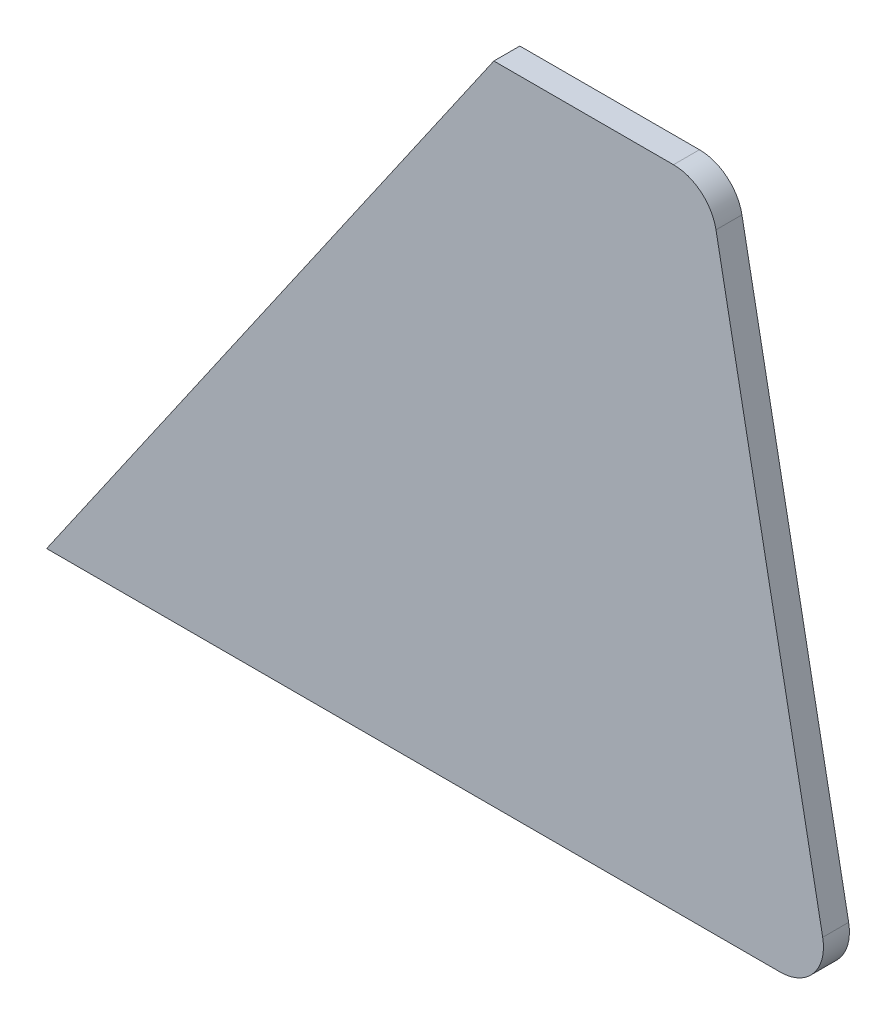
ISO-10303-21;
HEADER;
FILE_DESCRIPTION(('STEP AP214'),'2;1');
FILE_NAME('part.step','',(''),(''),'','','');
FILE_SCHEMA(('AUTOMOTIVE_DESIGN { 1 0 10303 214 1 1 1 1 }'));
ENDSEC;
DATA;
#1=APPLICATION_CONTEXT('core data for automotive mechanical design processes');
#2=APPLICATION_PROTOCOL_DEFINITION('international standard','automotive_design',2000,#1);
#3=PRODUCT_CONTEXT('',#1,'mechanical');
#4=PRODUCT('Part','Part','',(#3));
#5=PRODUCT_RELATED_PRODUCT_CATEGORY('part','',(#4));
#6=PRODUCT_DEFINITION_FORMATION('','',#4);
#7=PRODUCT_DEFINITION_CONTEXT('part definition',#1,'design');
#8=PRODUCT_DEFINITION('design','',#6,#7);
#9=PRODUCT_DEFINITION_SHAPE('','',#8);
#10=(LENGTH_UNIT() NAMED_UNIT(*) SI_UNIT(.MILLI.,.METRE.));
#11=(NAMED_UNIT(*) PLANE_ANGLE_UNIT() SI_UNIT($,.RADIAN.));
#12=(NAMED_UNIT(*) SI_UNIT($,.STERADIAN.) SOLID_ANGLE_UNIT());
#13=UNCERTAINTY_MEASURE_WITH_UNIT(LENGTH_MEASURE(1.E-05),#10,'distance_accuracy_value','');
#14=(GEOMETRIC_REPRESENTATION_CONTEXT(3) GLOBAL_UNCERTAINTY_ASSIGNED_CONTEXT((#13)) GLOBAL_UNIT_ASSIGNED_CONTEXT((#10,
#11,#12)) REPRESENTATION_CONTEXT('',''));
#15=CARTESIAN_POINT('',(0.,0.,0.));
#16=DIRECTION('',(0.,0.,1.));
#17=DIRECTION('',(1.,0.,0.));
#18=AXIS2_PLACEMENT_3D('',#15,#16,#17);
#19=CARTESIAN_POINT('',(-51.692763365665,-74.6538310553804,3.));
#20=DIRECTION('',(0.822144041030739,-0.569279523430842,0.));
#21=DIRECTION('',(0.569279523430842,0.822144041030739,0.));
#22=AXIS2_PLACEMENT_3D('',#19,#20,#21);
#23=PLANE('',#22);
#24=DIRECTION('',(-0.569279523430842,-0.822144041030739,0.));
#25=VECTOR('',#24,1.);
#26=CARTESIAN_POINT('',(-51.692763365665,-74.6538310553804,0.));
#27=LINE('',#26,#25);
#28=CARTESIAN_POINT('',(0.,0.,0.));
#29=VERTEX_POINT('',#28);
#30=CARTESIAN_POINT('',(-51.692763365665,-74.6538310553804,0.));
#31=VERTEX_POINT('',#30);
#32=EDGE_CURVE('E108',#29,#31,#27,.T.);
#33=ORIENTED_EDGE('',*,*,#32,.T.);
#34=DIRECTION('',(0.,0.,-1.));
#35=VECTOR('',#34,1.);
#36=CARTESIAN_POINT('',(-51.692763365665,-74.6538310553804,3.));
#37=LINE('',#36,#35);
#38=CARTESIAN_POINT('',(-51.692763365665,-74.6538310553804,3.));
#39=VERTEX_POINT('',#38);
#40=EDGE_CURVE('E93',#39,#31,#37,.T.);
#41=ORIENTED_EDGE('',*,*,#40,.F.);
#42=DIRECTION('',(-0.569279523430842,-0.822144041030739,0.));
#43=VECTOR('',#42,1.);
#44=CARTESIAN_POINT('',(-51.692763365665,-74.6538310553804,3.));
#45=LINE('',#44,#43);
#46=CARTESIAN_POINT('',(0.,0.,3.));
#47=VERTEX_POINT('',#46);
#48=EDGE_CURVE('E97',#47,#39,#45,.T.);
#49=ORIENTED_EDGE('',*,*,#48,.F.);
#50=DIRECTION('',(0.,0.,-1.));
#51=VECTOR('',#50,1.);
#52=CARTESIAN_POINT('',(0.,0.,3.));
#53=LINE('',#52,#51);
#54=EDGE_CURVE('E110',#47,#29,#53,.T.);
#55=ORIENTED_EDGE('',*,*,#54,.T.);
#56=EDGE_LOOP('',(#33,#41,#49,#55));
#57=FACE_BOUND('',#56,.T.);
#58=ADVANCED_FACE('F36',(#57),#23,.F.);
#59=CARTESIAN_POINT('',(39.1409799085148,-74.6538310553804,3.));
#60=DIRECTION('',(0.,1.,0.));
#61=DIRECTION('',(-1.,0.,0.));
#62=AXIS2_PLACEMENT_3D('',#59,#60,#61);
#63=PLANE('',#62);
#64=DIRECTION('',(1.,0.,0.));
#65=VECTOR('',#64,1.);
#66=CARTESIAN_POINT('',(39.1409799085148,-74.6538310553804,0.));
#67=LINE('',#66,#65);
#68=CARTESIAN_POINT('',(33.0970181564668,-74.6538310553804,0.));
#69=VERTEX_POINT('',#68);
#70=EDGE_CURVE('E136',#31,#69,#67,.T.);
#71=ORIENTED_EDGE('',*,*,#70,.T.);
#72=DIRECTION('',(0.,0.,-1.));
#73=VECTOR('',#72,1.);
#74=CARTESIAN_POINT('',(33.0970181564668,-74.6538310553804,3.));
#75=LINE('',#74,#73);
#76=CARTESIAN_POINT('',(33.0970181564668,-74.6538310553804,3.));
#77=VERTEX_POINT('',#76);
#78=EDGE_CURVE('E59',#69,#77,#75,.F.);
#79=ORIENTED_EDGE('',*,*,#78,.T.);
#80=DIRECTION('',(1.,0.,0.));
#81=VECTOR('',#80,1.);
#82=CARTESIAN_POINT('',(39.1409799085148,-74.6538310553804,3.));
#83=LINE('',#82,#81);
#84=EDGE_CURVE('E89',#39,#77,#83,.T.);
#85=ORIENTED_EDGE('',*,*,#84,.F.);
#86=ORIENTED_EDGE('',*,*,#40,.T.);
#87=EDGE_LOOP('',(#71,#79,#85,#86));
#88=FACE_BOUND('',#87,.T.);
#89=ADVANCED_FACE('F91',(#88),#63,.F.);
#90=CARTESIAN_POINT('',(24.9,0.,3.));
#91=DIRECTION('',(-0.982287250728689,-0.187381314585722,0.));
#92=DIRECTION('',(0.187381314585722,-0.982287250728689,0.));
#93=AXIS2_PLACEMENT_3D('',#90,#91,#92);
#94=PLANE('',#93);
#95=DIRECTION('',(-0.187381314585722,0.982287250728689,0.));
#96=VECTOR('',#95,1.);
#97=CARTESIAN_POINT('',(24.9,0.,3.));
#98=LINE('',#97,#96);
#99=CARTESIAN_POINT('',(38.0084544101103,-68.7169244824518,3.));
#100=VERTEX_POINT('',#99);
#101=CARTESIAN_POINT('',(25.6750765237811,-4.06309342707139,3.));
#102=VERTEX_POINT('',#101);
#103=EDGE_CURVE('E96',#100,#102,#98,.T.);
#104=ORIENTED_EDGE('',*,*,#103,.F.);
#105=DIRECTION('',(0.,0.,-1.));
#106=VECTOR('',#105,1.);
#107=CARTESIAN_POINT('',(38.0084544101103,-68.7169244824518,3.));
#108=LINE('',#107,#106);
#109=CARTESIAN_POINT('',(38.0084544101103,-68.7169244824518,0.));
#110=VERTEX_POINT('',#109);
#111=EDGE_CURVE('E112',#100,#110,#108,.T.);
#112=ORIENTED_EDGE('',*,*,#111,.T.);
#113=DIRECTION('',(-0.187381314585722,0.982287250728689,0.));
#114=VECTOR('',#113,1.);
#115=CARTESIAN_POINT('',(24.9,0.,0.));
#116=LINE('',#115,#114);
#117=CARTESIAN_POINT('',(25.6750765237811,-4.06309342707139,0.));
#118=VERTEX_POINT('',#117);
#119=EDGE_CURVE('E137',#110,#118,#116,.T.);
#120=ORIENTED_EDGE('',*,*,#119,.T.);
#121=DIRECTION('',(0.,0.,-1.));
#122=VECTOR('',#121,1.);
#123=CARTESIAN_POINT('',(25.6750765237811,-4.06309342707139,3.));
#124=LINE('',#123,#122);
#125=EDGE_CURVE('E109',#118,#102,#124,.F.);
#126=ORIENTED_EDGE('',*,*,#125,.T.);
#127=EDGE_LOOP('',(#104,#112,#120,#126));
#128=FACE_BOUND('',#127,.T.);
#129=ADVANCED_FACE('F128',(#128),#94,.F.);
#130=CARTESIAN_POINT('',(0.,0.,3.));
#131=DIRECTION('',(0.,-1.,0.));
#132=DIRECTION('',(0.,0.,-1.));
#133=AXIS2_PLACEMENT_3D('',#130,#131,#132);
#134=PLANE('',#133);
#135=DIRECTION('',(-1.,0.,0.));
#136=VECTOR('',#135,1.);
#137=CARTESIAN_POINT('',(0.,0.,3.));
#138=LINE('',#137,#136);
#139=CARTESIAN_POINT('',(20.7636402701376,0.,3.));
#140=VERTEX_POINT('',#139);
#141=EDGE_CURVE('E101',#140,#47,#138,.T.);
#142=ORIENTED_EDGE('',*,*,#141,.F.);
#143=DIRECTION('',(0.,0.,-1.));
#144=VECTOR('',#143,1.);
#145=CARTESIAN_POINT('',(20.7636402701376,0.,3.));
#146=LINE('',#145,#144);
#147=CARTESIAN_POINT('',(20.7636402701376,0.,0.));
#148=VERTEX_POINT('',#147);
#149=EDGE_CURVE('E11',#140,#148,#146,.T.);
#150=ORIENTED_EDGE('',*,*,#149,.T.);
#151=DIRECTION('',(-1.,0.,0.));
#152=VECTOR('',#151,1.);
#153=CARTESIAN_POINT('',(0.,0.,0.));
#154=LINE('',#153,#152);
#155=EDGE_CURVE('E105',#148,#29,#154,.T.);
#156=ORIENTED_EDGE('',*,*,#155,.T.);
#157=ORIENTED_EDGE('',*,*,#54,.F.);
#158=EDGE_LOOP('',(#142,#150,#156,#157));
#159=FACE_BOUND('',#158,.T.);
#160=ADVANCED_FACE('F144',(#159),#134,.F.);
#161=CARTESIAN_POINT('',(0.,0.,3.));
#162=DIRECTION('',(0.,0.,-1.));
#163=DIRECTION('',(-1.,0.,0.));
#164=AXIS2_PLACEMENT_3D('',#161,#162,#163);
#165=PLANE('',#164);
#166=ORIENTED_EDGE('',*,*,#84,.T.);
#167=CARTESIAN_POINT('',(33.0970181564668,-69.6538310553804,3.));
#168=DIRECTION('',(0.,0.,-1.));
#169=DIRECTION('',(-1.,0.,0.));
#170=AXIS2_PLACEMENT_3D('',#167,#168,#169);
#171=CIRCLE('',#170,5.);
#172=EDGE_CURVE('E44',#77,#100,#171,.F.);
#173=ORIENTED_EDGE('',*,*,#172,.T.);
#174=ORIENTED_EDGE('',*,*,#103,.T.);
#175=CARTESIAN_POINT('',(20.7636402701376,-5.,3.));
#176=DIRECTION('',(0.,0.,-1.));
#177=DIRECTION('',(-1.,0.,0.));
#178=AXIS2_PLACEMENT_3D('',#175,#176,#177);
#179=CIRCLE('',#178,5.);
#180=EDGE_CURVE('E51',#102,#140,#179,.F.);
#181=ORIENTED_EDGE('',*,*,#180,.T.);
#182=ORIENTED_EDGE('',*,*,#141,.T.);
#183=ORIENTED_EDGE('',*,*,#48,.T.);
#184=EDGE_LOOP('',(#166,#173,#174,#181,#182,#183));
#185=FACE_BOUND('',#184,.T.);
#186=ADVANCED_FACE('F100',(#185),#165,.F.);
#187=CARTESIAN_POINT('',(0.,0.,0.));
#188=DIRECTION('',(0.,0.,-1.));
#189=DIRECTION('',(-1.,0.,0.));
#190=AXIS2_PLACEMENT_3D('',#187,#188,#189);
#191=PLANE('',#190);
#192=ORIENTED_EDGE('',*,*,#119,.F.);
#193=CARTESIAN_POINT('',(33.0970181564668,-69.6538310553804,0.));
#194=DIRECTION('',(0.,0.,-1.));
#195=DIRECTION('',(-1.,0.,0.));
#196=AXIS2_PLACEMENT_3D('',#193,#194,#195);
#197=CIRCLE('',#196,5.);
#198=EDGE_CURVE('E121',#110,#69,#197,.T.);
#199=ORIENTED_EDGE('',*,*,#198,.T.);
#200=ORIENTED_EDGE('',*,*,#70,.F.);
#201=ORIENTED_EDGE('',*,*,#32,.F.);
#202=ORIENTED_EDGE('',*,*,#155,.F.);
#203=CARTESIAN_POINT('',(20.7636402701376,-5.,0.));
#204=DIRECTION('',(0.,0.,-1.));
#205=DIRECTION('',(-1.,0.,0.));
#206=AXIS2_PLACEMENT_3D('',#203,#204,#205);
#207=CIRCLE('',#206,5.);
#208=EDGE_CURVE('E119',#148,#118,#207,.T.);
#209=ORIENTED_EDGE('',*,*,#208,.T.);
#210=EDGE_LOOP('',(#192,#199,#200,#201,#202,#209));
#211=FACE_BOUND('',#210,.T.);
#212=ADVANCED_FACE('F135',(#211),#191,.T.);
#213=CARTESIAN_POINT('',(33.0970181564668,-69.6538310553804,3.));
#214=DIRECTION('',(0.,0.,-1.));
#215=DIRECTION('',(-1.,0.,0.));
#216=AXIS2_PLACEMENT_3D('',#213,#214,#215);
#217=CYLINDRICAL_SURFACE('',#216,5.);
#218=ORIENTED_EDGE('',*,*,#172,.F.);
#219=ORIENTED_EDGE('',*,*,#78,.F.);
#220=ORIENTED_EDGE('',*,*,#198,.F.);
#221=ORIENTED_EDGE('',*,*,#111,.F.);
#222=EDGE_LOOP('',(#218,#219,#220,#221));
#223=FACE_BOUND('',#222,.T.);
#224=ADVANCED_FACE('F133',(#223),#217,.T.);
#225=CARTESIAN_POINT('',(20.7636402701376,-5.,3.));
#226=DIRECTION('',(0.,0.,-1.));
#227=DIRECTION('',(-1.,0.,0.));
#228=AXIS2_PLACEMENT_3D('',#225,#226,#227);
#229=CYLINDRICAL_SURFACE('',#228,5.);
#230=ORIENTED_EDGE('',*,*,#180,.F.);
#231=ORIENTED_EDGE('',*,*,#125,.F.);
#232=ORIENTED_EDGE('',*,*,#208,.F.);
#233=ORIENTED_EDGE('',*,*,#149,.F.);
#234=EDGE_LOOP('',(#230,#231,#232,#233));
#235=FACE_BOUND('',#234,.T.);
#236=ADVANCED_FACE('F38',(#235),#229,.T.);
#237=CLOSED_SHELL('',(#58,#89,#129,#160,#186,#212,#224,#236));
#238=MANIFOLD_SOLID_BREP('B2',#237);
#239=ADVANCED_BREP_SHAPE_REPRESENTATION('',(#18,#238),#14);
#240=SHAPE_DEFINITION_REPRESENTATION(#9,#239);
ENDSEC;
END-ISO-10303-21;
